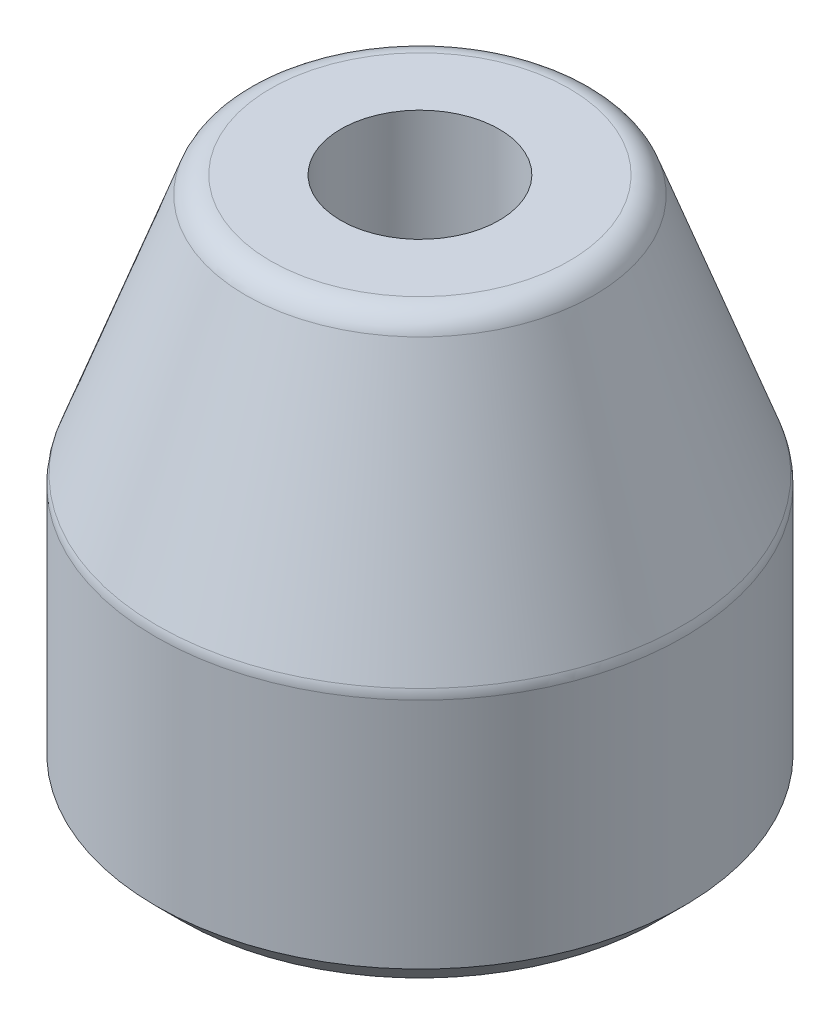
ISO-10303-21;
HEADER;
FILE_DESCRIPTION(('STEP AP214'),'2;1');
FILE_NAME('part.step','',(''),(''),'','','');
FILE_SCHEMA(('AUTOMOTIVE_DESIGN { 1 0 10303 214 1 1 1 1 }'));
ENDSEC;
DATA;
#1=APPLICATION_CONTEXT('core data for automotive mechanical design processes');
#2=APPLICATION_PROTOCOL_DEFINITION('international standard','automotive_design',2000,#1);
#3=PRODUCT_CONTEXT('',#1,'mechanical');
#4=PRODUCT('Part','Part','',(#3));
#5=PRODUCT_RELATED_PRODUCT_CATEGORY('part','',(#4));
#6=PRODUCT_DEFINITION_FORMATION('','',#4);
#7=PRODUCT_DEFINITION_CONTEXT('part definition',#1,'design');
#8=PRODUCT_DEFINITION('design','',#6,#7);
#9=PRODUCT_DEFINITION_SHAPE('','',#8);
#10=(LENGTH_UNIT() NAMED_UNIT(*) SI_UNIT(.MILLI.,.METRE.));
#11=(NAMED_UNIT(*) PLANE_ANGLE_UNIT() SI_UNIT($,.RADIAN.));
#12=(NAMED_UNIT(*) SI_UNIT($,.STERADIAN.) SOLID_ANGLE_UNIT());
#13=UNCERTAINTY_MEASURE_WITH_UNIT(LENGTH_MEASURE(1.E-05),#10,'distance_accuracy_value','');
#14=(GEOMETRIC_REPRESENTATION_CONTEXT(3) GLOBAL_UNCERTAINTY_ASSIGNED_CONTEXT((#13)) GLOBAL_UNIT_ASSIGNED_CONTEXT((#10,
#11,#12)) REPRESENTATION_CONTEXT('',''));
#15=CARTESIAN_POINT('',(0.,0.,0.));
#16=DIRECTION('',(0.,0.,1.));
#17=DIRECTION('',(1.,0.,0.));
#18=AXIS2_PLACEMENT_3D('',#15,#16,#17);
#19=CARTESIAN_POINT('',(0.,0.,0.));
#20=DIRECTION('',(0.,1.,0.));
#21=DIRECTION('',(0.,0.,1.));
#22=AXIS2_PLACEMENT_3D('',#19,#20,#21);
#23=CYLINDRICAL_SURFACE('',#22,1.5);
#24=CARTESIAN_POINT('',(0.,10.,0.));
#25=DIRECTION('',(0.,1.,0.));
#26=DIRECTION('',(0.,0.,1.));
#27=AXIS2_PLACEMENT_3D('',#24,#25,#26);
#28=CIRCLE('',#27,1.5);
#29=CARTESIAN_POINT('',(0.,10.,1.5));
#30=VERTEX_POINT('',#29);
#31=EDGE_CURVE('E63',#30,#30,#28,.T.);
#32=ORIENTED_EDGE('',*,*,#31,.T.);
#33=EDGE_LOOP('',(#32));
#34=FACE_BOUND('',#33,.T.);
#35=CARTESIAN_POINT('',(0.,6.94092783617022,0.));
#36=DIRECTION('',(0.,-1.,0.));
#37=DIRECTION('',(0.,0.,-1.));
#38=AXIS2_PLACEMENT_3D('',#35,#36,#37);
#39=CIRCLE('',#38,1.5);
#40=CARTESIAN_POINT('',(0.,6.94092783617022,-1.5));
#41=VERTEX_POINT('',#40);
#42=EDGE_CURVE('E64',#41,#41,#39,.F.);
#43=ORIENTED_EDGE('',*,*,#42,.F.);
#44=EDGE_LOOP('',(#43));
#45=FACE_BOUND('',#44,.T.);
#46=ADVANCED_FACE('F31',(#34,#45),#23,.F.);
#47=CARTESIAN_POINT('',(0.,10.,0.));
#48=DIRECTION('',(0.,-1.,0.));
#49=DIRECTION('',(0.,0.,-1.));
#50=AXIS2_PLACEMENT_3D('',#47,#48,#49);
#51=CYLINDRICAL_SURFACE('',#50,5.);
#52=CARTESIAN_POINT('',(0.,4.91183650964572,0.));
#53=DIRECTION('',(0.,1.,0.));
#54=DIRECTION('',(0.,0.,1.));
#55=AXIS2_PLACEMENT_3D('',#52,#53,#54);
#56=CIRCLE('',#55,5.);
#57=CARTESIAN_POINT('',(0.,4.91183650964572,5.));
#58=VERTEX_POINT('',#57);
#59=EDGE_CURVE('E46',#58,#58,#56,.F.);
#60=ORIENTED_EDGE('',*,*,#59,.T.);
#61=EDGE_LOOP('',(#60));
#62=FACE_BOUND('',#61,.T.);
#63=CARTESIAN_POINT('',(0.,0.5,0.));
#64=DIRECTION('',(0.,1.,0.));
#65=DIRECTION('',(0.,0.,1.));
#66=AXIS2_PLACEMENT_3D('',#63,#64,#65);
#67=CIRCLE('',#66,5.);
#68=CARTESIAN_POINT('',(0.,0.5,5.));
#69=VERTEX_POINT('',#68);
#70=EDGE_CURVE('E60',#69,#69,#67,.T.);
#71=ORIENTED_EDGE('',*,*,#70,.T.);
#72=EDGE_LOOP('',(#71));
#73=FACE_BOUND('',#72,.T.);
#74=ADVANCED_FACE('F92',(#62,#73),#51,.T.);
#75=CARTESIAN_POINT('',(0.,10.,0.));
#76=DIRECTION('',(0.,1.,0.));
#77=DIRECTION('',(0.,0.,1.));
#78=AXIS2_PLACEMENT_3D('',#75,#76,#77);
#79=PLANE('',#78);
#80=CARTESIAN_POINT('',(0.,10.,0.));
#81=DIRECTION('',(0.,1.,0.));
#82=DIRECTION('',(0.,0.,1.));
#83=AXIS2_PLACEMENT_3D('',#80,#81,#82);
#84=CIRCLE('',#83,2.83004505956413);
#85=CARTESIAN_POINT('',(0.,10.,2.83004505956413));
#86=VERTEX_POINT('',#85);
#87=EDGE_CURVE('E10',#86,#86,#84,.T.);
#88=ORIENTED_EDGE('',*,*,#87,.T.);
#89=EDGE_LOOP('',(#88));
#90=FACE_BOUND('',#89,.T.);
#91=ORIENTED_EDGE('',*,*,#31,.F.);
#92=EDGE_LOOP('',(#91));
#93=FACE_BOUND('',#92,.T.);
#94=ADVANCED_FACE('F97',(#90,#93),#79,.T.);
#95=CARTESIAN_POINT('',(0.,0.,0.));
#96=DIRECTION('',(0.,1.,0.));
#97=DIRECTION('',(0.,0.,1.));
#98=AXIS2_PLACEMENT_3D('',#95,#96,#97);
#99=PLANE('',#98);
#100=CARTESIAN_POINT('',(0.,0.,0.));
#101=DIRECTION('',(0.,1.,0.));
#102=DIRECTION('',(0.,0.,1.));
#103=AXIS2_PLACEMENT_3D('',#100,#101,#102);
#104=CIRCLE('',#103,4.5);
#105=CARTESIAN_POINT('',(0.,0.,4.5));
#106=VERTEX_POINT('',#105);
#107=EDGE_CURVE('E54',#106,#106,#104,.F.);
#108=ORIENTED_EDGE('',*,*,#107,.T.);
#109=EDGE_LOOP('',(#108));
#110=FACE_BOUND('',#109,.T.);
#111=CARTESIAN_POINT('',(0.,0.,0.));
#112=DIRECTION('',(0.,1.,0.));
#113=DIRECTION('',(0.,0.,1.));
#114=AXIS2_PLACEMENT_3D('',#111,#112,#113);
#115=CIRCLE('',#114,3.75);
#116=CARTESIAN_POINT('',(0.,0.,3.75));
#117=VERTEX_POINT('',#116);
#118=EDGE_CURVE('E57',#117,#117,#115,.T.);
#119=ORIENTED_EDGE('',*,*,#118,.T.);
#120=EDGE_LOOP('',(#119));
#121=FACE_BOUND('',#120,.T.);
#122=ADVANCED_FACE('F104',(#110,#121),#99,.F.);
#123=CARTESIAN_POINT('',(0.,10.,0.));
#124=DIRECTION('',(0.,-1.,0.));
#125=DIRECTION('',(0.,0.,-1.));
#126=AXIS2_PLACEMENT_3D('',#123,#124,#125);
#127=CONICAL_SURFACE('',#126,3.18014882866899,0.349065850398863);
#128=CARTESIAN_POINT('',(0.,5.08284658130855,0.));
#129=DIRECTION('',(0.,-1.,0.));
#130=DIRECTION('',(0.,0.,-1.));
#131=AXIS2_PLACEMENT_3D('',#128,#129,#130);
#132=CIRCLE('',#131,4.96984631039296);
#133=CARTESIAN_POINT('',(0.,5.08284658130855,-4.96984631039296));
#134=VERTEX_POINT('',#133);
#135=EDGE_CURVE('E38',#134,#134,#132,.F.);
#136=ORIENTED_EDGE('',*,*,#135,.T.);
#137=EDGE_LOOP('',(#136));
#138=FACE_BOUND('',#137,.T.);
#139=CARTESIAN_POINT('',(0.,9.67101007166283,0.));
#140=DIRECTION('',(0.,1.,0.));
#141=DIRECTION('',(0.,0.,1.));
#142=AXIS2_PLACEMENT_3D('',#139,#140,#141);
#143=CIRCLE('',#142,3.29989136995709);
#144=CARTESIAN_POINT('',(0.,9.67101007166283,3.29989136995709));
#145=VERTEX_POINT('',#144);
#146=EDGE_CURVE('E42',#145,#145,#143,.F.);
#147=ORIENTED_EDGE('',*,*,#146,.T.);
#148=EDGE_LOOP('',(#147));
#149=FACE_BOUND('',#148,.T.);
#150=ADVANCED_FACE('F88',(#138,#149),#127,.T.);
#151=CARTESIAN_POINT('',(0.,6.94092783617022,0.));
#152=DIRECTION('',(0.,-1.,0.));
#153=DIRECTION('',(0.,0.,-1.));
#154=AXIS2_PLACEMENT_3D('',#151,#152,#153);
#155=PLANE('',#154);
#156=CARTESIAN_POINT('',(0.,6.94092783617022,0.));
#157=DIRECTION('',(0.,-1.,0.));
#158=DIRECTION('',(0.,0.,-1.));
#159=AXIS2_PLACEMENT_3D('',#156,#157,#158);
#160=CIRCLE('',#159,3.18942744042854);
#161=CARTESIAN_POINT('',(0.,6.94092783617022,-3.18942744042854));
#162=VERTEX_POINT('',#161);
#163=EDGE_CURVE('E67',#162,#162,#160,.T.);
#164=ORIENTED_EDGE('',*,*,#163,.T.);
#165=EDGE_LOOP('',(#164));
#166=FACE_BOUND('',#165,.T.);
#167=ORIENTED_EDGE('',*,*,#42,.T.);
#168=EDGE_LOOP('',(#167));
#169=FACE_BOUND('',#168,.T.);
#170=ADVANCED_FACE('F73',(#166,#169),#155,.T.);
#171=CARTESIAN_POINT('',(0.,0.,0.));
#172=DIRECTION('',(0.,-1.,0.));
#173=DIRECTION('',(0.,0.,-1.));
#174=AXIS2_PLACEMENT_3D('',#171,#172,#173);
#175=CONICAL_SURFACE('',#174,3.25,0.00872664625997167);
#176=CARTESIAN_POINT('',(0.,0.504401848243019,0.));
#177=DIRECTION('',(0.,1.,0.));
#178=DIRECTION('',(0.,0.,1.));
#179=AXIS2_PLACEMENT_3D('',#176,#177,#178);
#180=CIRCLE('',#179,3.24559815175697);
#181=CARTESIAN_POINT('',(0.,0.504401848243019,3.24559815175697));
#182=VERTEX_POINT('',#181);
#183=EDGE_CURVE('E51',#182,#182,#180,.F.);
#184=ORIENTED_EDGE('',*,*,#183,.T.);
#185=EDGE_LOOP('',(#184));
#186=FACE_BOUND('',#185,.T.);
#187=ORIENTED_EDGE('',*,*,#163,.F.);
#188=EDGE_LOOP('',(#187));
#189=FACE_BOUND('',#188,.T.);
#190=ADVANCED_FACE('F76',(#186,#189),#175,.F.);
#191=CARTESIAN_POINT('',(0.,0.5,0.));
#192=DIRECTION('',(0.,1.,0.));
#193=DIRECTION('',(0.,0.,1.));
#194=AXIS2_PLACEMENT_3D('',#191,#192,#193);
#195=CONICAL_SURFACE('',#194,5.,0.785398163397451);
#196=ORIENTED_EDGE('',*,*,#107,.F.);
#197=EDGE_LOOP('',(#196));
#198=FACE_BOUND('',#197,.T.);
#199=ORIENTED_EDGE('',*,*,#70,.F.);
#200=EDGE_LOOP('',(#199));
#201=FACE_BOUND('',#200,.T.);
#202=ADVANCED_FACE('F78',(#198,#201),#195,.T.);
#203=CARTESIAN_POINT('',(0.,0.504401848243032,0.));
#204=DIRECTION('',(0.,-1.,0.));
#205=DIRECTION('',(0.,0.,-1.));
#206=AXIS2_PLACEMENT_3D('',#203,#204,#205);
#207=CONICAL_SURFACE('',#206,3.24559815175697,0.785398163397451);
#208=ORIENTED_EDGE('',*,*,#118,.F.);
#209=EDGE_LOOP('',(#208));
#210=FACE_BOUND('',#209,.T.);
#211=ORIENTED_EDGE('',*,*,#183,.F.);
#212=EDGE_LOOP('',(#211));
#213=FACE_BOUND('',#212,.T.);
#214=ADVANCED_FACE('F85',(#210,#213),#207,.F.);
#215=CARTESIAN_POINT('',(0.,4.91183650964572,0.));
#216=DIRECTION('',(0.,1.,0.));
#217=DIRECTION('',(0.,0.,1.));
#218=AXIS2_PLACEMENT_3D('',#215,#216,#217);
#219=TOROIDAL_SURFACE('',#218,4.5,0.5);
#220=ORIENTED_EDGE('',*,*,#135,.F.);
#221=EDGE_LOOP('',(#220));
#222=FACE_BOUND('',#221,.T.);
#223=ORIENTED_EDGE('',*,*,#59,.F.);
#224=EDGE_LOOP('',(#223));
#225=FACE_BOUND('',#224,.T.);
#226=ADVANCED_FACE('F111',(#222,#225),#219,.T.);
#227=CARTESIAN_POINT('',(0.,9.5,0.));
#228=DIRECTION('',(0.,1.,0.));
#229=DIRECTION('',(0.,0.,1.));
#230=AXIS2_PLACEMENT_3D('',#227,#228,#229);
#231=TOROIDAL_SURFACE('',#230,2.83004505956413,0.5);
#232=ORIENTED_EDGE('',*,*,#146,.F.);
#233=EDGE_LOOP('',(#232));
#234=FACE_BOUND('',#233,.T.);
#235=ORIENTED_EDGE('',*,*,#87,.F.);
#236=EDGE_LOOP('',(#235));
#237=FACE_BOUND('',#236,.T.);
#238=ADVANCED_FACE('F33',(#234,#237),#231,.T.);
#239=CLOSED_SHELL('',(#46,#74,#94,#122,#150,#170,#190,#202,#214,#226,#238));
#240=MANIFOLD_SOLID_BREP('B2',#239);
#241=ADVANCED_BREP_SHAPE_REPRESENTATION('',(#18,#240),#14);
#242=SHAPE_DEFINITION_REPRESENTATION(#9,#241);
ENDSEC;
END-ISO-10303-21;
